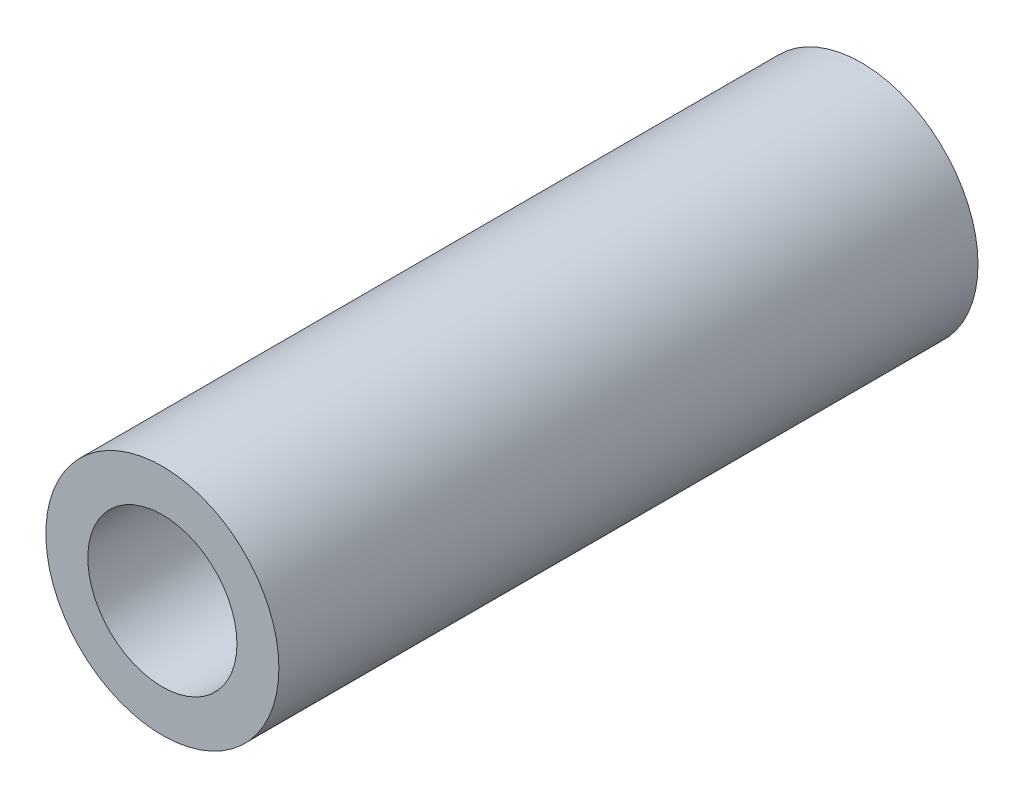
ISO-10303-21;
HEADER;
FILE_DESCRIPTION(('STEP AP214'),'2;1');
FILE_NAME('part.step','',(''),(''),'','','');
FILE_SCHEMA(('AUTOMOTIVE_DESIGN { 1 0 10303 214 1 1 1 1 }'));
ENDSEC;
DATA;
#1=APPLICATION_CONTEXT('core data for automotive mechanical design processes');
#2=APPLICATION_PROTOCOL_DEFINITION('international standard','automotive_design',2000,#1);
#3=PRODUCT_CONTEXT('',#1,'mechanical');
#4=PRODUCT('Part','Part','',(#3));
#5=PRODUCT_RELATED_PRODUCT_CATEGORY('part','',(#4));
#6=PRODUCT_DEFINITION_FORMATION('','',#4);
#7=PRODUCT_DEFINITION_CONTEXT('part definition',#1,'design');
#8=PRODUCT_DEFINITION('design','',#6,#7);
#9=PRODUCT_DEFINITION_SHAPE('','',#8);
#10=(LENGTH_UNIT() NAMED_UNIT(*) SI_UNIT(.MILLI.,.METRE.));
#11=(NAMED_UNIT(*) PLANE_ANGLE_UNIT() SI_UNIT($,.RADIAN.));
#12=(NAMED_UNIT(*) SI_UNIT($,.STERADIAN.) SOLID_ANGLE_UNIT());
#13=UNCERTAINTY_MEASURE_WITH_UNIT(LENGTH_MEASURE(1.E-05),#10,'distance_accuracy_value','');
#14=(GEOMETRIC_REPRESENTATION_CONTEXT(3) GLOBAL_UNCERTAINTY_ASSIGNED_CONTEXT((#13)) GLOBAL_UNIT_ASSIGNED_CONTEXT((#10,
#11,#12)) REPRESENTATION_CONTEXT('',''));
#15=CARTESIAN_POINT('',(0.,0.,0.));
#16=DIRECTION('',(0.,0.,1.));
#17=DIRECTION('',(1.,0.,0.));
#18=AXIS2_PLACEMENT_3D('',#15,#16,#17);
#19=CARTESIAN_POINT('',(0.,0.,30.));
#20=DIRECTION('',(0.,0.,1.));
#21=DIRECTION('',(1.,0.,0.));
#22=AXIS2_PLACEMENT_3D('',#19,#20,#21);
#23=PLANE('',#22);
#24=CARTESIAN_POINT('',(0.,0.,30.));
#25=DIRECTION('',(0.,0.,1.));
#26=DIRECTION('',(1.,0.,0.));
#27=AXIS2_PLACEMENT_3D('',#24,#25,#26);
#28=CIRCLE('',#27,5.);
#29=CARTESIAN_POINT('',(5.,0.,30.));
#30=VERTEX_POINT('',#29);
#31=EDGE_CURVE('E10',#30,#30,#28,.T.);
#32=ORIENTED_EDGE('',*,*,#31,.T.);
#33=EDGE_LOOP('',(#32));
#34=FACE_BOUND('',#33,.T.);
#35=CARTESIAN_POINT('',(0.,0.,30.));
#36=DIRECTION('',(0.,0.,1.));
#37=DIRECTION('',(1.,0.,0.));
#38=AXIS2_PLACEMENT_3D('',#35,#36,#37);
#39=CIRCLE('',#38,3.2);
#40=CARTESIAN_POINT('',(3.2,0.,30.));
#41=VERTEX_POINT('',#40);
#42=EDGE_CURVE('E50',#41,#41,#39,.T.);
#43=ORIENTED_EDGE('',*,*,#42,.F.);
#44=EDGE_LOOP('',(#43));
#45=FACE_BOUND('',#44,.T.);
#46=ADVANCED_FACE('F37',(#34,#45),#23,.T.);
#47=CARTESIAN_POINT('',(0.,0.,0.));
#48=DIRECTION('',(0.,0.,1.));
#49=DIRECTION('',(1.,0.,0.));
#50=AXIS2_PLACEMENT_3D('',#47,#48,#49);
#51=PLANE('',#50);
#52=CARTESIAN_POINT('',(0.,0.,0.));
#53=DIRECTION('',(0.,0.,1.));
#54=DIRECTION('',(1.,0.,0.));
#55=AXIS2_PLACEMENT_3D('',#52,#53,#54);
#56=CIRCLE('',#55,5.);
#57=CARTESIAN_POINT('',(5.,0.,0.));
#58=VERTEX_POINT('',#57);
#59=EDGE_CURVE('E41',#58,#58,#56,.T.);
#60=ORIENTED_EDGE('',*,*,#59,.F.);
#61=EDGE_LOOP('',(#60));
#62=FACE_BOUND('',#61,.T.);
#63=CARTESIAN_POINT('',(0.,0.,0.));
#64=DIRECTION('',(0.,0.,1.));
#65=DIRECTION('',(1.,0.,0.));
#66=AXIS2_PLACEMENT_3D('',#63,#64,#65);
#67=CIRCLE('',#66,3.2);
#68=CARTESIAN_POINT('',(3.2,0.,0.));
#69=VERTEX_POINT('',#68);
#70=EDGE_CURVE('E52',#69,#69,#67,.T.);
#71=ORIENTED_EDGE('',*,*,#70,.T.);
#72=EDGE_LOOP('',(#71));
#73=FACE_BOUND('',#72,.T.);
#74=ADVANCED_FACE('F64',(#62,#73),#51,.F.);
#75=CARTESIAN_POINT('',(0.,0.,30.));
#76=DIRECTION('',(0.,0.,-1.));
#77=DIRECTION('',(-1.,0.,0.));
#78=AXIS2_PLACEMENT_3D('',#75,#76,#77);
#79=CYLINDRICAL_SURFACE('',#78,5.);
#80=ORIENTED_EDGE('',*,*,#31,.F.);
#81=EDGE_LOOP('',(#80));
#82=FACE_BOUND('',#81,.T.);
#83=ORIENTED_EDGE('',*,*,#59,.T.);
#84=EDGE_LOOP('',(#83));
#85=FACE_BOUND('',#84,.T.);
#86=ADVANCED_FACE('F39',(#82,#85),#79,.T.);
#87=CARTESIAN_POINT('',(0.,0.,30.));
#88=DIRECTION('',(0.,0.,-1.));
#89=DIRECTION('',(-1.,0.,0.));
#90=AXIS2_PLACEMENT_3D('',#87,#88,#89);
#91=CYLINDRICAL_SURFACE('',#90,3.2);
#92=ORIENTED_EDGE('',*,*,#42,.T.);
#93=EDGE_LOOP('',(#92));
#94=FACE_BOUND('',#93,.T.);
#95=ORIENTED_EDGE('',*,*,#70,.F.);
#96=EDGE_LOOP('',(#95));
#97=FACE_BOUND('',#96,.T.);
#98=ADVANCED_FACE('F60',(#94,#97),#91,.F.);
#99=CLOSED_SHELL('',(#46,#74,#86,#98));
#100=MANIFOLD_SOLID_BREP('B2',#99);
#101=ADVANCED_BREP_SHAPE_REPRESENTATION('',(#18,#100),#14);
#102=SHAPE_DEFINITION_REPRESENTATION(#9,#101);
ENDSEC;
END-ISO-10303-21;
